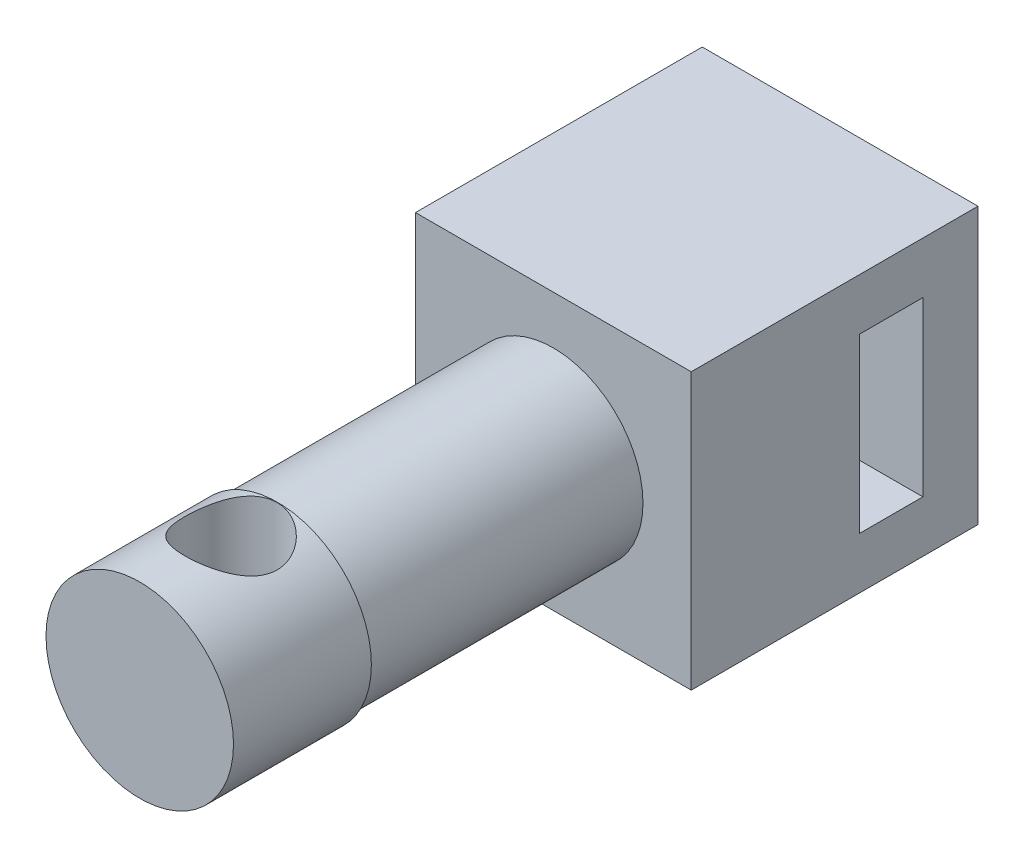
ISO-10303-21;
HEADER;
FILE_DESCRIPTION(('STEP AP214'),'2;1');
FILE_NAME('part.step','',(''),(''),'','','');
FILE_SCHEMA(('AUTOMOTIVE_DESIGN { 1 0 10303 214 1 1 1 1 }'));
ENDSEC;
DATA;
#1=APPLICATION_CONTEXT('core data for automotive mechanical design processes');
#2=APPLICATION_PROTOCOL_DEFINITION('international standard','automotive_design',2000,#1);
#3=PRODUCT_CONTEXT('',#1,'mechanical');
#4=PRODUCT('Part','Part','',(#3));
#5=PRODUCT_RELATED_PRODUCT_CATEGORY('part','',(#4));
#6=PRODUCT_DEFINITION_FORMATION('','',#4);
#7=PRODUCT_DEFINITION_CONTEXT('part definition',#1,'design');
#8=PRODUCT_DEFINITION('design','',#6,#7);
#9=PRODUCT_DEFINITION_SHAPE('','',#8);
#10=(LENGTH_UNIT() NAMED_UNIT(*) SI_UNIT(.MILLI.,.METRE.));
#11=(NAMED_UNIT(*) PLANE_ANGLE_UNIT() SI_UNIT($,.RADIAN.));
#12=(NAMED_UNIT(*) SI_UNIT($,.STERADIAN.) SOLID_ANGLE_UNIT());
#13=UNCERTAINTY_MEASURE_WITH_UNIT(LENGTH_MEASURE(1.E-05),#10,'distance_accuracy_value','');
#14=(GEOMETRIC_REPRESENTATION_CONTEXT(3) GLOBAL_UNCERTAINTY_ASSIGNED_CONTEXT((#13)) GLOBAL_UNIT_ASSIGNED_CONTEXT((#10,
#11,#12)) REPRESENTATION_CONTEXT('',''));
#15=CARTESIAN_POINT('',(0.,0.,0.));
#16=DIRECTION('',(0.,0.,1.));
#17=DIRECTION('',(1.,0.,0.));
#18=AXIS2_PLACEMENT_3D('',#15,#16,#17);
#19=CARTESIAN_POINT('',(0.,0.,16.1));
#20=DIRECTION('',(0.,0.,1.));
#21=DIRECTION('',(1.,0.,0.));
#22=AXIS2_PLACEMENT_3D('',#19,#20,#21);
#23=PLANE('',#22);
#24=CARTESIAN_POINT('',(0.,9.85,16.1));
#25=DIRECTION('',(0.,0.,1.));
#26=DIRECTION('',(1.,0.,0.));
#27=AXIS2_PLACEMENT_3D('',#24,#25,#26);
#28=CIRCLE('',#27,3.4);
#29=CARTESIAN_POINT('',(3.40000000000009,9.85,16.1));
#30=VERTEX_POINT('',#29);
#31=EDGE_CURVE('E385',#30,#30,#28,.T.);
#32=ORIENTED_EDGE('',*,*,#31,.T.);
#33=EDGE_LOOP('',(#32));
#34=FACE_BOUND('',#33,.T.);
#35=ADVANCED_FACE('F98',(#34),#23,.T.);
#36=CARTESIAN_POINT('',(0.,0.,11.1));
#37=DIRECTION('',(0.,0.,1.));
#38=DIRECTION('',(1.,0.,0.));
#39=AXIS2_PLACEMENT_3D('',#36,#37,#38);
#40=PLANE('',#39);
#41=CARTESIAN_POINT('',(0.,9.85,11.1));
#42=DIRECTION('',(0.,0.,1.));
#43=DIRECTION('',(1.,0.,0.));
#44=AXIS2_PLACEMENT_3D('',#41,#42,#43);
#45=CIRCLE('',#44,3.25);
#46=CARTESIAN_POINT('',(3.25,9.85,11.1));
#47=VERTEX_POINT('',#46);
#48=EDGE_CURVE('E207',#47,#47,#45,.T.);
#49=ORIENTED_EDGE('',*,*,#48,.T.);
#50=EDGE_LOOP('',(#49));
#51=FACE_BOUND('',#50,.T.);
#52=CARTESIAN_POINT('',(0.,9.85,11.1));
#53=DIRECTION('',(0.,0.,1.));
#54=DIRECTION('',(1.,0.,0.));
#55=AXIS2_PLACEMENT_3D('',#52,#53,#54);
#56=CIRCLE('',#55,3.4);
#57=CARTESIAN_POINT('',(3.40000000000009,9.85,11.1));
#58=VERTEX_POINT('',#57);
#59=EDGE_CURVE('E382',#58,#58,#56,.T.);
#60=ORIENTED_EDGE('',*,*,#59,.F.);
#61=EDGE_LOOP('',(#60));
#62=FACE_BOUND('',#61,.T.);
#63=ADVANCED_FACE('F297',(#51,#62),#40,.F.);
#64=CARTESIAN_POINT('',(0.,16.45,12.79));
#65=DIRECTION('',(0.,-1.,0.));
#66=DIRECTION('',(0.,0.,-1.));
#67=AXIS2_PLACEMENT_3D('',#64,#65,#66);
#68=CYLINDRICAL_SURFACE('',#67,1.675);
#69=CARTESIAN_POINT('',(0.,6.45,14.465));
#70=CARTESIAN_POINT('',(0.0882871792061729,6.45000400904776,14.4649954163885));
#71=CARTESIAN_POINT('',(0.176626211185832,6.45347315785561,14.457984175796));
#72=CARTESIAN_POINT('',(0.350649838604163,6.46700030885061,14.4302600717879));
#73=CARTESIAN_POINT('',(0.436331563152796,6.47706519384237,14.4095328952516));
#74=CARTESIAN_POINT('',(0.60233562305834,6.50272866845969,14.3553800635004));
#75=CARTESIAN_POINT('',(0.682675505426738,6.51830795655852,14.3219986720344));
#76=CARTESIAN_POINT('',(0.836519096595816,6.5535665344146,14.2437253210454));
#77=CARTESIAN_POINT('',(0.910022046068694,6.5732462787948,14.1988320850618));
#78=CARTESIAN_POINT('',(1.05297582120693,6.61625006576738,14.0957885327901));
#79=CARTESIAN_POINT('',(1.12192985124425,6.63972080906699,14.0370111627886));
#80=CARTESIAN_POINT('',(1.24945474589376,6.68716887444669,13.9092168699198));
#81=CARTESIAN_POINT('',(1.30801837698201,6.71114653653462,13.840192874544));
#82=CARTESIAN_POINT('',(1.41748664234534,6.75895449466706,13.6876694273657));
#83=CARTESIAN_POINT('',(1.46749178813093,6.78263985513284,13.6034736742731));
#84=CARTESIAN_POINT('',(1.55242059767323,6.8247310603081,13.4265708784595));
#85=CARTESIAN_POINT('',(1.58735472786879,6.84314056597278,13.3338697969049));
#86=CARTESIAN_POINT('',(1.63891646197032,6.87094463835127,13.1481886231686));
#87=CARTESIAN_POINT('',(1.65650370285459,6.88080756141553,13.0555486014029));
#88=CARTESIAN_POINT('',(1.67581844607841,6.89166099045505,12.8681505848692));
#89=CARTESIAN_POINT('',(1.67756077414817,6.89265979037079,12.7733946531677));
#90=CARTESIAN_POINT('',(1.66584143661571,6.88605090621676,12.5961879312901));
#91=CARTESIAN_POINT('',(1.65410884483375,6.87942182797977,12.5135775468775));
#92=CARTESIAN_POINT('',(1.61875936185074,6.86001328974783,12.3516961395594));
#93=CARTESIAN_POINT('',(1.59513888169567,6.84723197244245,12.2724261329511));
#94=CARTESIAN_POINT('',(1.53624368290819,6.81667297999784,12.1172179664189));
#95=CARTESIAN_POINT('',(1.50070987258089,6.79878567376079,12.0414007206949));
#96=CARTESIAN_POINT('',(1.4191939089499,6.76002861789904,11.8964476686919));
#97=CARTESIAN_POINT('',(1.3732073120358,6.73915760126591,11.8273147218595));
#98=CARTESIAN_POINT('',(1.26551699447029,6.69369167631314,11.6887724262714));
#99=CARTESIAN_POINT('',(1.20257791395622,6.6689538177496,11.6203670137203));
#100=CARTESIAN_POINT('',(1.06598892848053,6.62061682892649,11.4946574318073));
#101=CARTESIAN_POINT('',(0.992332145095995,6.59701844301153,11.437360447127));
#102=CARTESIAN_POINT('',(0.832277847307563,6.55234716671061,11.333135101527));
#103=CARTESIAN_POINT('',(0.745460083117523,6.53143275447305,11.2867794758876));
#104=CARTESIAN_POINT('',(0.564025220942731,6.49584303152225,11.2097568257422));
#105=CARTESIAN_POINT('',(0.469423442458666,6.48115580010245,11.1790598028354));
#106=CARTESIAN_POINT('',(0.311670213605497,6.46375853040415,11.1430655469007));
#107=CARTESIAN_POINT('',(0.249926476516642,6.45862502920277,11.1325665314483));
#108=CARTESIAN_POINT('',(0.12546383289755,6.45174448628554,11.1185324312833));
#109=CARTESIAN_POINT('',(0.0627450114372447,6.44999715080094,11.114996742463));
#110=CARTESIAN_POINT('',(-0.0882871792060007,6.45000400904776,11.1150045836115));
#111=CARTESIAN_POINT('',(-0.176626211185659,6.45347315785561,11.1220158242039));
#112=CARTESIAN_POINT('',(-0.350649838603993,6.46700030885061,11.1497399282121));
#113=CARTESIAN_POINT('',(-0.436331563152627,6.47706519384237,11.1704671047484));
#114=CARTESIAN_POINT('',(-0.602335623058175,6.50272866845969,11.2246199364996));
#115=CARTESIAN_POINT('',(-0.682675505426575,6.51830795655852,11.2580013279656));
#116=CARTESIAN_POINT('',(-0.836519096595659,6.55356653441461,11.3362746789545));
#117=CARTESIAN_POINT('',(-0.910022046068541,6.5732462787948,11.3811679149381));
#118=CARTESIAN_POINT('',(-1.05297582120679,6.61625006576739,11.4842114672098));
#119=CARTESIAN_POINT('',(-1.12192985124411,6.639720809067,11.5429888372113));
#120=CARTESIAN_POINT('',(-1.24945474589364,6.68716887444671,11.6707831300801));
#121=CARTESIAN_POINT('',(-1.30801837698189,6.71114653653464,11.7398071254558));
#122=CARTESIAN_POINT('',(-1.41748664234524,6.75895449466709,11.8923305726341));
#123=CARTESIAN_POINT('',(-1.46749178813083,6.78263985513287,11.9765263257267));
#124=CARTESIAN_POINT('',(-1.55242059767315,6.82473106030815,12.1534291215403));
#125=CARTESIAN_POINT('',(-1.58735472786872,6.84314056597283,12.246130203095));
#126=CARTESIAN_POINT('',(-1.63891646197028,6.87094463835134,12.4318113768312));
#127=CARTESIAN_POINT('',(-1.65650370285456,6.88080756141561,12.524451398597));
#128=CARTESIAN_POINT('',(-1.67581844607841,6.89166099045515,12.7118494151306));
#129=CARTESIAN_POINT('',(-1.67756077414817,6.89265979037089,12.8066053468321));
#130=CARTESIAN_POINT('',(-1.66584143661573,6.88605090621686,12.9838120687097));
#131=CARTESIAN_POINT('',(-1.65410884483377,6.87942182797988,13.0664224531223));
#132=CARTESIAN_POINT('',(-1.61875936185079,6.86001328974795,13.2283038604404));
#133=CARTESIAN_POINT('',(-1.59513888169572,6.84723197244257,13.3075738670488));
#134=CARTESIAN_POINT('',(-1.53624368290826,6.81667297999797,13.4627820335809));
#135=CARTESIAN_POINT('',(-1.50070987258097,6.79878567376092,13.538599279305));
#136=CARTESIAN_POINT('',(-1.41919390895001,6.76002861789916,13.683552331308));
#137=CARTESIAN_POINT('',(-1.37320731203591,6.73915760126604,13.7526852781403));
#138=CARTESIAN_POINT('',(-1.26551699447043,6.69369167631327,13.8912275737284));
#139=CARTESIAN_POINT('',(-1.20257791395637,6.66895381774972,13.9596329862795));
#140=CARTESIAN_POINT('',(-1.0659889284807,6.6206168289266,14.0853425681925));
#141=CARTESIAN_POINT('',(-0.992332145096175,6.59701844301164,14.1426395528729));
#142=CARTESIAN_POINT('',(-0.832277847307761,6.5523471667107,14.2468648984729));
#143=CARTESIAN_POINT('',(-0.745460083117726,6.53143275447314,14.2932205241123));
#144=CARTESIAN_POINT('',(-0.564025220942941,6.49584303152231,14.3702431742577));
#145=CARTESIAN_POINT('',(-0.469423442458878,6.48115580010251,14.4009401971645));
#146=CARTESIAN_POINT('',(-0.311670213605649,6.46375853040418,14.4369344530993));
#147=CARTESIAN_POINT('',(-0.24992647651673,6.45862502920279,14.4474334685517));
#148=CARTESIAN_POINT('',(-0.125463832897509,6.45174448628555,14.4614675687167));
#149=CARTESIAN_POINT('',(-0.0627450114371386,6.44999715080094,14.465003257537));
#150=CARTESIAN_POINT('',(0.,6.45,14.465));
#151=B_SPLINE_CURVE_WITH_KNOTS('',3,(#69,#70,#71,#72,#73,#74,#75,#76,#77,#78,#79,#80,#81,#82,
#83,#84,#85,#86,#87,#88,#89,#90,#91,#92,#93,#94,#95,#96,#97,#98,#99,#100,#101,#102,#103,#104,
#105,#106,#107,#108,#109,#110,#111,#112,#113,#114,#115,#116,#117,#118,#119,#120,#121,#122,#123,
#124,#125,#126,#127,#128,#129,#130,#131,#132,#133,#134,#135,#136,#137,#138,#139,#140,#141,#142,
#143,#144,#145,#146,#147,#148,#149,#150),.UNSPECIFIED.,.T.,.F.,(4,2,2,2,2,2,2,2,2,2,2,2,2,2,2,2,
2,2,2,2,2,2,2,2,2,2,2,2,2,2,2,2,2,2,2,2,2,2,2,2,4),(0.,0.264615472637016,0.529507518346893,
0.793481410623898,1.0574845856191,1.33710243173149,1.61691418310247,1.91763760995452,
2.21815185448431,2.500911227548,2.78340600174401,3.03334409042691,3.28335768073376,
3.53920538357832,3.79516205457897,4.08247908841657,4.36998133701063,4.67023781002504,
4.96991687744241,5.15799335269931,5.34605351054286,5.61066898317987,5.87556102888975,
6.13953492116675,6.40353809616195,6.68315594227433,6.96296769364531,7.26369112049737,
7.56420536502716,7.84696473809086,8.12945951228689,8.37939760096978,8.62941119127663,
8.88525889412117,9.14121556512181,9.4285325989594,9.71603484755345,10.0162913205679,
10.3159703879853,10.5040468632423,10.6921070210861),.UNSPECIFIED.);
#152=CARTESIAN_POINT('',(0.,6.45,14.465));
#153=VERTEX_POINT('',#152);
#154=EDGE_CURVE('E12',#153,#153,#151,.T.);
#155=ORIENTED_EDGE('',*,*,#154,.F.);
#156=EDGE_LOOP('',(#155));
#157=FACE_BOUND('',#156,.T.);
#158=CARTESIAN_POINT('',(0.,13.25,14.465));
#159=CARTESIAN_POINT('',(-0.0882871792060006,13.2499959909522,14.4649954163885));
#160=CARTESIAN_POINT('',(-0.176626211185659,13.2465268421444,14.4579841757961));
#161=CARTESIAN_POINT('',(-0.350649838603992,13.2329996911494,14.4302600717879));
#162=CARTESIAN_POINT('',(-0.436331563152626,13.2229348061576,14.4095328952516));
#163=CARTESIAN_POINT('',(-0.602335623058174,13.1972713315403,14.3553800635004));
#164=CARTESIAN_POINT('',(-0.682675505426574,13.1816920434415,14.3219986720344));
#165=CARTESIAN_POINT('',(-0.836519096595659,13.1464334655854,14.2437253210455));
#166=CARTESIAN_POINT('',(-0.91002204606854,13.1267537212052,14.1988320850619));
#167=CARTESIAN_POINT('',(-1.05297582120679,13.0837499342326,14.0957885327902));
#168=CARTESIAN_POINT('',(-1.12192985124411,13.060279190933,14.0370111627887));
#169=CARTESIAN_POINT('',(-1.24945474589364,13.0128311255533,13.9092168699199));
#170=CARTESIAN_POINT('',(-1.30801837698189,12.9888534634654,13.8401928745442));
#171=CARTESIAN_POINT('',(-1.41748664234524,12.9410455053329,13.6876694273659));
#172=CARTESIAN_POINT('',(-1.46749178813083,12.9173601448671,13.6034736742733));
#173=CARTESIAN_POINT('',(-1.55242059767315,12.8752689396918,13.4265708784597));
#174=CARTESIAN_POINT('',(-1.58735472786872,12.8568594340272,13.333869796905));
#175=CARTESIAN_POINT('',(-1.63891646197028,12.8290553616487,13.1481886231688));
#176=CARTESIAN_POINT('',(-1.65650370285456,12.8191924385844,13.055548601403));
#177=CARTESIAN_POINT('',(-1.67581844607841,12.8083390095448,12.8681505848694));
#178=CARTESIAN_POINT('',(-1.67756077414817,12.8073402096291,12.7733946531679));
#179=CARTESIAN_POINT('',(-1.66584143661573,12.8139490937831,12.5961879312903));
#180=CARTESIAN_POINT('',(-1.65410884483377,12.8205781720201,12.5135775468777));
#181=CARTESIAN_POINT('',(-1.61875936185079,12.839986710252,12.3516961395596));
#182=CARTESIAN_POINT('',(-1.59513888169572,12.8527680275574,12.2724261329512));
#183=CARTESIAN_POINT('',(-1.53624368290827,12.883327020002,12.1172179664191));
#184=CARTESIAN_POINT('',(-1.50070987258097,12.9012143262391,12.041400720695));
#185=CARTESIAN_POINT('',(-1.41919390895001,12.9399713821008,11.896447668692));
#186=CARTESIAN_POINT('',(-1.37320731203591,12.960842398734,11.8273147218597));
#187=CARTESIAN_POINT('',(-1.26551699447043,13.0063083236867,11.6887724262716));
#188=CARTESIAN_POINT('',(-1.20257791395637,13.0310461822503,11.6203670137205));
#189=CARTESIAN_POINT('',(-1.0659889284807,13.0793831710734,11.4946574318075));
#190=CARTESIAN_POINT('',(-0.992332145096178,13.1029815569884,11.4373604471271));
#191=CARTESIAN_POINT('',(-0.832277847307764,13.1476528332893,11.3331351015271));
#192=CARTESIAN_POINT('',(-0.745460083117729,13.1685672455269,11.2867794758877));
#193=CARTESIAN_POINT('',(-0.564025220942944,13.2041569684777,11.2097568257423));
#194=CARTESIAN_POINT('',(-0.46942344245888,13.2188441998975,11.1790598028355));
#195=CARTESIAN_POINT('',(-0.311670213605664,13.2362414695958,11.1430655469008));
#196=CARTESIAN_POINT('',(-0.24992647651676,13.2413749707972,11.1325665314483));
#197=CARTESIAN_POINT('',(-0.125463832897567,13.2482555137144,11.1185324312833));
#198=CARTESIAN_POINT('',(-0.0627450114372098,13.2500028491991,11.114996742463));
#199=CARTESIAN_POINT('',(0.0882871792061021,13.2499959909522,11.1150045836115));
#200=CARTESIAN_POINT('',(0.176626211185775,13.2465268421444,11.1220158242039));
#201=CARTESIAN_POINT('',(0.350649838604136,13.2329996911494,11.1497399282121));
#202=CARTESIAN_POINT('',(0.436331563152783,13.2229348061576,11.1704671047484));
#203=CARTESIAN_POINT('',(0.602335623058342,13.1972713315403,11.2246199364996));
#204=CARTESIAN_POINT('',(0.68267550542674,13.1816920434415,11.2580013279656));
#205=CARTESIAN_POINT('',(0.836519096595818,13.1464334655854,11.3362746789546));
#206=CARTESIAN_POINT('',(0.910022046068695,13.1267537212052,11.3811679149382));
#207=CARTESIAN_POINT('',(1.05297582120693,13.0837499342326,11.4842114672099));
#208=CARTESIAN_POINT('',(1.12192985124425,13.060279190933,11.5429888372114));
#209=CARTESIAN_POINT('',(1.24945474589377,13.0128311255533,11.6707831300802));
#210=CARTESIAN_POINT('',(1.30801837698201,12.9888534634654,11.739807125456));
#211=CARTESIAN_POINT('',(1.41748664234534,12.9410455053329,11.8923305726343));
#212=CARTESIAN_POINT('',(1.46749178813093,12.9173601448672,11.9765263257269));
#213=CARTESIAN_POINT('',(1.55242059767323,12.8752689396919,12.1534291215405));
#214=CARTESIAN_POINT('',(1.58735472786879,12.8568594340272,12.2461302030951));
#215=CARTESIAN_POINT('',(1.63891646197032,12.8290553616487,12.4318113768314));
#216=CARTESIAN_POINT('',(1.65650370285459,12.8191924385845,12.5244513985971));
#217=CARTESIAN_POINT('',(1.67581844607841,12.8083390095449,12.7118494151308));
#218=CARTESIAN_POINT('',(1.67756077414817,12.8073402096292,12.8066053468323));
#219=CARTESIAN_POINT('',(1.66584143661571,12.8139490937832,12.9838120687099));
#220=CARTESIAN_POINT('',(1.65410884483374,12.8205781720202,13.0664224531225));
#221=CARTESIAN_POINT('',(1.61875936185074,12.8399867102522,13.2283038604406));
#222=CARTESIAN_POINT('',(1.59513888169567,12.8527680275575,13.3075738670489));
#223=CARTESIAN_POINT('',(1.53624368290819,12.8833270200022,13.4627820335811));
#224=CARTESIAN_POINT('',(1.50070987258089,12.9012143262392,13.5385992793051));
#225=CARTESIAN_POINT('',(1.41919390894991,12.939971382101,13.6835523313081));
#226=CARTESIAN_POINT('',(1.3732073120358,12.9608423987341,13.7526852781404));
#227=CARTESIAN_POINT('',(1.26551699447029,13.0063083236869,13.8912275737286));
#228=CARTESIAN_POINT('',(1.20257791395622,13.0310461822504,13.9596329862797));
#229=CARTESIAN_POINT('',(1.06598892848053,13.0793831710735,14.0853425681927));
#230=CARTESIAN_POINT('',(0.992332145095993,13.1029815569885,14.142639552873));
#231=CARTESIAN_POINT('',(0.832277847307561,13.1476528332894,14.246864898473));
#232=CARTESIAN_POINT('',(0.745460083117521,13.1685672455269,14.2932205241124));
#233=CARTESIAN_POINT('',(0.564025220942729,13.2041569684777,14.3702431742578));
#234=CARTESIAN_POINT('',(0.469423442458664,13.2188441998975,14.4009401971646));
#235=CARTESIAN_POINT('',(0.311670213605495,13.2362414695958,14.4369344530993));
#236=CARTESIAN_POINT('',(0.24992647651664,13.2413749707972,14.4474334685517));
#237=CARTESIAN_POINT('',(0.125463832897549,13.2482555137145,14.4614675687167));
#238=CARTESIAN_POINT('',(0.0627450114372443,13.2500028491991,14.465003257537));
#239=CARTESIAN_POINT('',(0.,13.25,14.465));
#240=B_SPLINE_CURVE_WITH_KNOTS('',3,(#158,#159,#160,#161,#162,#163,#164,#165,#166,#167,#168,
#169,#170,#171,#172,#173,#174,#175,#176,#177,#178,#179,#180,#181,#182,#183,#184,#185,#186,#187,
#188,#189,#190,#191,#192,#193,#194,#195,#196,#197,#198,#199,#200,#201,#202,#203,#204,#205,#206,
#207,#208,#209,#210,#211,#212,#213,#214,#215,#216,#217,#218,#219,#220,#221,#222,#223,#224,#225,
#226,#227,#228,#229,#230,#231,#232,#233,#234,#235,#236,#237,#238,#239),.UNSPECIFIED.,.T.,.F.,(4,
2,2,2,2,2,2,2,2,2,2,2,2,2,2,2,2,2,2,2,2,2,2,2,2,2,2,2,2,2,2,2,2,2,2,2,2,2,2,2,4),(0.,
0.264615472637013,0.529507518346888,0.79348141062389,1.05748458561909,1.33710243173148,
1.61691418310245,1.91763760995451,2.2181518544843,2.50091122754801,2.78340600174403,
3.03334409042692,3.28335768073377,3.53920538357831,3.79516205457895,4.08247908841654,
4.36998133701059,4.67023781002501,4.9699168774424,5.15799335269944,5.34605351054315,
5.61066898318021,5.87556102889013,6.13953492116713,6.40353809616234,6.68315594227472,
6.9629676936457,7.26369112049775,7.56420536502754,7.84696473809124,8.12945951228724,
8.37939760097014,8.62941119127699,8.88525889412155,9.1412155651222,9.4285325989598,
9.71603484755386,10.0162913205683,10.3159703879856,10.5040468632425,10.6921070210861),.UNSPECIFIED.);
#241=CARTESIAN_POINT('',(0.,13.25,14.465));
#242=VERTEX_POINT('',#241);
#243=EDGE_CURVE('E111',#242,#242,#240,.T.);
#244=ORIENTED_EDGE('',*,*,#243,.F.);
#245=EDGE_LOOP('',(#244));
#246=FACE_BOUND('',#245,.T.);
#247=ADVANCED_FACE('F279',(#157,#246),#68,.F.);
#248=CARTESIAN_POINT('',(5.,5.,5.));
#249=DIRECTION('',(-1.,0.,0.));
#250=DIRECTION('',(0.,0.,1.));
#251=AXIS2_PLACEMENT_3D('',#248,#249,#250);
#252=PLANE('',#251);
#253=DIRECTION('',(0.,0.,1.));
#254=VECTOR('',#253,1.);
#255=CARTESIAN_POINT('',(5.,14.85,-7.3));
#256=LINE('',#255,#254);
#257=CARTESIAN_POINT('',(5.,14.85,-9.3));
#258=VERTEX_POINT('',#257);
#259=CARTESIAN_POINT('',(5.,14.85,1.1));
#260=VERTEX_POINT('',#259);
#261=EDGE_CURVE('E179',#258,#260,#256,.T.);
#262=ORIENTED_EDGE('',*,*,#261,.T.);
#263=DIRECTION('',(0.,1.,0.));
#264=VECTOR('',#263,1.);
#265=CARTESIAN_POINT('',(5.,4.85,1.1));
#266=LINE('',#265,#264);
#267=CARTESIAN_POINT('',(5.,4.85,1.1));
#268=VERTEX_POINT('',#267);
#269=EDGE_CURVE('E183',#268,#260,#266,.T.);
#270=ORIENTED_EDGE('',*,*,#269,.F.);
#271=DIRECTION('',(0.,0.,1.));
#272=VECTOR('',#271,1.);
#273=CARTESIAN_POINT('',(5.,4.85,-7.3));
#274=LINE('',#273,#272);
#275=CARTESIAN_POINT('',(5.,4.85,-9.3));
#276=VERTEX_POINT('',#275);
#277=EDGE_CURVE('E268',#276,#268,#274,.T.);
#278=ORIENTED_EDGE('',*,*,#277,.F.);
#279=DIRECTION('',(0.,-1.,0.));
#280=VECTOR('',#279,1.);
#281=CARTESIAN_POINT('',(5.,4.85,-9.3));
#282=LINE('',#281,#280);
#283=EDGE_CURVE('E185',#258,#276,#282,.T.);
#284=ORIENTED_EDGE('',*,*,#283,.F.);
#285=EDGE_LOOP('',(#262,#270,#278,#284));
#286=FACE_BOUND('',#285,.T.);
#287=DIRECTION('',(0.,1.,0.));
#288=VECTOR('',#287,1.);
#289=CARTESIAN_POINT('',(5.,4.85,-5.));
#290=LINE('',#289,#288);
#291=CARTESIAN_POINT('',(5.,6.72076154099223,-5.));
#292=VERTEX_POINT('',#291);
#293=CARTESIAN_POINT('',(5.,12.9792384590078,-5.));
#294=VERTEX_POINT('',#293);
#295=EDGE_CURVE('E204',#292,#294,#290,.T.);
#296=ORIENTED_EDGE('',*,*,#295,.T.);
#297=DIRECTION('',(0.,0.,1.));
#298=VECTOR('',#297,1.);
#299=CARTESIAN_POINT('',(5.,12.9792384590078,-7.3));
#300=LINE('',#299,#298);
#301=CARTESIAN_POINT('',(5.,12.9792384590078,-7.3));
#302=VERTEX_POINT('',#301);
#303=EDGE_CURVE('E190',#302,#294,#300,.T.);
#304=ORIENTED_EDGE('',*,*,#303,.F.);
#305=DIRECTION('',(0.,-1.,0.));
#306=VECTOR('',#305,1.);
#307=CARTESIAN_POINT('',(5.,4.85,-7.3));
#308=LINE('',#307,#306);
#309=CARTESIAN_POINT('',(5.,6.72076154099223,-7.3));
#310=VERTEX_POINT('',#309);
#311=EDGE_CURVE('E219',#302,#310,#308,.T.);
#312=ORIENTED_EDGE('',*,*,#311,.T.);
#313=DIRECTION('',(0.,0.,1.));
#314=VECTOR('',#313,1.);
#315=CARTESIAN_POINT('',(5.,6.72076154099223,-7.3));
#316=LINE('',#315,#314);
#317=EDGE_CURVE('E270',#310,#292,#316,.T.);
#318=ORIENTED_EDGE('',*,*,#317,.T.);
#319=EDGE_LOOP('',(#296,#304,#312,#318));
#320=FACE_BOUND('',#319,.T.);
#321=ADVANCED_FACE('F100',(#286,#320),#252,.F.);
#322=CARTESIAN_POINT('',(-5.,5.,5.));
#323=DIRECTION('',(1.,0.,0.));
#324=DIRECTION('',(0.,0.,-1.));
#325=AXIS2_PLACEMENT_3D('',#322,#323,#324);
#326=PLANE('',#325);
#327=DIRECTION('',(0.,0.,1.));
#328=VECTOR('',#327,1.);
#329=CARTESIAN_POINT('',(-5.,4.85,-7.3));
#330=LINE('',#329,#328);
#331=CARTESIAN_POINT('',(-5.,4.85,-9.3));
#332=VERTEX_POINT('',#331);
#333=CARTESIAN_POINT('',(-5.,4.85,1.1));
#334=VERTEX_POINT('',#333);
#335=EDGE_CURVE('E266',#332,#334,#330,.T.);
#336=ORIENTED_EDGE('',*,*,#335,.T.);
#337=DIRECTION('',(0.,-1.,0.));
#338=VECTOR('',#337,1.);
#339=CARTESIAN_POINT('',(-5.,4.85,1.1));
#340=LINE('',#339,#338);
#341=CARTESIAN_POINT('',(-5.,14.85,1.1));
#342=VERTEX_POINT('',#341);
#343=EDGE_CURVE('E198',#342,#334,#340,.T.);
#344=ORIENTED_EDGE('',*,*,#343,.F.);
#345=DIRECTION('',(0.,0.,1.));
#346=VECTOR('',#345,1.);
#347=CARTESIAN_POINT('',(-5.,14.85,-7.3));
#348=LINE('',#347,#346);
#349=CARTESIAN_POINT('',(-5.,14.85,-9.3));
#350=VERTEX_POINT('',#349);
#351=EDGE_CURVE('E189',#350,#342,#348,.T.);
#352=ORIENTED_EDGE('',*,*,#351,.F.);
#353=DIRECTION('',(0.,1.,0.));
#354=VECTOR('',#353,1.);
#355=CARTESIAN_POINT('',(-5.,4.85,-9.3));
#356=LINE('',#355,#354);
#357=EDGE_CURVE('E228',#332,#350,#356,.T.);
#358=ORIENTED_EDGE('',*,*,#357,.F.);
#359=EDGE_LOOP('',(#336,#344,#352,#358));
#360=FACE_BOUND('',#359,.T.);
#361=ADVANCED_FACE('F356',(#360),#326,.F.);
#362=CARTESIAN_POINT('',(2.91017511363836,5.04057115574417,-7.3));
#363=DIRECTION('',(0.5,0.866025403784439,0.));
#364=DIRECTION('',(-0.866025403784439,0.5,0.));
#365=AXIS2_PLACEMENT_3D('',#362,#363,#364);
#366=PLANE('',#365);
#367=DIRECTION('',(-0.866025403784439,0.5,0.));
#368=VECTOR('',#367,1.);
#369=CARTESIAN_POINT('',(2.91017511363836,5.04057115574417,-5.));
#370=LINE('',#369,#368);
#371=CARTESIAN_POINT('',(0.,6.72076154099223,-5.));
#372=VERTEX_POINT('',#371);
#373=CARTESIAN_POINT('',(-2.71,8.28538077049611,-5.));
#374=VERTEX_POINT('',#373);
#375=EDGE_CURVE('E231',#372,#374,#370,.T.);
#376=ORIENTED_EDGE('',*,*,#375,.F.);
#377=DIRECTION('',(0.,0.,1.));
#378=VECTOR('',#377,1.);
#379=CARTESIAN_POINT('',(0.,6.72076154099223,-7.3));
#380=LINE('',#379,#378);
#381=CARTESIAN_POINT('',(0.,6.72076154099223,-7.3));
#382=VERTEX_POINT('',#381);
#383=EDGE_CURVE('E273',#382,#372,#380,.T.);
#384=ORIENTED_EDGE('',*,*,#383,.F.);
#385=DIRECTION('',(-0.866025403784439,0.5,0.));
#386=VECTOR('',#385,1.);
#387=CARTESIAN_POINT('',(2.91017511363836,5.04057115574417,-7.3));
#388=LINE('',#387,#386);
#389=CARTESIAN_POINT('',(-2.71,8.28538077049611,-7.3));
#390=VERTEX_POINT('',#389);
#391=EDGE_CURVE('E124',#382,#390,#388,.T.);
#392=ORIENTED_EDGE('',*,*,#391,.T.);
#393=DIRECTION('',(0.,0.,1.));
#394=VECTOR('',#393,1.);
#395=CARTESIAN_POINT('',(-2.71,8.28538077049611,-7.3));
#396=LINE('',#395,#394);
#397=EDGE_CURVE('E245',#390,#374,#396,.T.);
#398=ORIENTED_EDGE('',*,*,#397,.T.);
#399=EDGE_LOOP('',(#376,#384,#392,#398));
#400=FACE_BOUND('',#399,.T.);
#401=ADVANCED_FACE('F353',(#400),#366,.T.);
#402=CARTESIAN_POINT('',(0.,6.72076154099223,-7.3));
#403=DIRECTION('',(0.,-1.,0.));
#404=DIRECTION('',(0.,0.,-1.));
#405=AXIS2_PLACEMENT_3D('',#402,#403,#404);
#406=PLANE('',#405);
#407=DIRECTION('',(1.,0.,0.));
#408=VECTOR('',#407,1.);
#409=CARTESIAN_POINT('',(0.,6.72076154099223,-5.));
#410=LINE('',#409,#408);
#411=EDGE_CURVE('E247',#372,#292,#410,.T.);
#412=ORIENTED_EDGE('',*,*,#411,.T.);
#413=ORIENTED_EDGE('',*,*,#317,.F.);
#414=DIRECTION('',(1.,0.,0.));
#415=VECTOR('',#414,1.);
#416=CARTESIAN_POINT('',(0.,6.72076154099223,-7.3));
#417=LINE('',#416,#415);
#418=EDGE_CURVE('E235',#382,#310,#417,.T.);
#419=ORIENTED_EDGE('',*,*,#418,.F.);
#420=ORIENTED_EDGE('',*,*,#383,.T.);
#421=EDGE_LOOP('',(#412,#413,#419,#420));
#422=FACE_BOUND('',#421,.T.);
#423=ADVANCED_FACE('F349',(#422),#406,.F.);
#424=CARTESIAN_POINT('',(0.,4.85,-7.3));
#425=DIRECTION('',(0.,1.,0.));
#426=DIRECTION('',(0.,0.,1.));
#427=AXIS2_PLACEMENT_3D('',#424,#425,#426);
#428=PLANE('',#427);
#429=ORIENTED_EDGE('',*,*,#277,.T.);
#430=DIRECTION('',(1.,0.,0.));
#431=VECTOR('',#430,1.);
#432=CARTESIAN_POINT('',(-5.,4.85,1.1));
#433=LINE('',#432,#431);
#434=EDGE_CURVE('E203',#334,#268,#433,.T.);
#435=ORIENTED_EDGE('',*,*,#434,.F.);
#436=ORIENTED_EDGE('',*,*,#335,.F.);
#437=DIRECTION('',(-1.,0.,0.));
#438=VECTOR('',#437,1.);
#439=CARTESIAN_POINT('',(5.,4.85,-9.3));
#440=LINE('',#439,#438);
#441=EDGE_CURVE('E225',#276,#332,#440,.T.);
#442=ORIENTED_EDGE('',*,*,#441,.F.);
#443=EDGE_LOOP('',(#429,#435,#436,#442));
#444=FACE_BOUND('',#443,.T.);
#445=ADVANCED_FACE('F346',(#444),#428,.F.);
#446=CARTESIAN_POINT('',(0.,14.85,-7.3));
#447=DIRECTION('',(0.,1.,0.));
#448=DIRECTION('',(0.,0.,1.));
#449=AXIS2_PLACEMENT_3D('',#446,#447,#448);
#450=PLANE('',#449);
#451=ORIENTED_EDGE('',*,*,#351,.T.);
#452=DIRECTION('',(-1.,0.,0.));
#453=VECTOR('',#452,1.);
#454=CARTESIAN_POINT('',(-5.,14.85,1.1));
#455=LINE('',#454,#453);
#456=EDGE_CURVE('E193',#260,#342,#455,.T.);
#457=ORIENTED_EDGE('',*,*,#456,.F.);
#458=ORIENTED_EDGE('',*,*,#261,.F.);
#459=DIRECTION('',(1.,0.,0.));
#460=VECTOR('',#459,1.);
#461=CARTESIAN_POINT('',(5.,14.85,-9.3));
#462=LINE('',#461,#460);
#463=EDGE_CURVE('E222',#350,#258,#462,.T.);
#464=ORIENTED_EDGE('',*,*,#463,.F.);
#465=EDGE_LOOP('',(#451,#457,#458,#464));
#466=FACE_BOUND('',#465,.T.);
#467=ADVANCED_FACE('F194',(#466),#450,.T.);
#468=CARTESIAN_POINT('',(0.,12.9792384590078,-7.3));
#469=DIRECTION('',(0.,-1.,0.));
#470=DIRECTION('',(0.,0.,-1.));
#471=AXIS2_PLACEMENT_3D('',#468,#469,#470);
#472=PLANE('',#471);
#473=DIRECTION('',(1.,0.,0.));
#474=VECTOR('',#473,1.);
#475=CARTESIAN_POINT('',(0.,12.9792384590078,-5.));
#476=LINE('',#475,#474);
#477=CARTESIAN_POINT('',(0.,12.9792384590078,-5.));
#478=VERTEX_POINT('',#477);
#479=EDGE_CURVE('E250',#478,#294,#476,.T.);
#480=ORIENTED_EDGE('',*,*,#479,.F.);
#481=DIRECTION('',(0.,0.,1.));
#482=VECTOR('',#481,1.);
#483=CARTESIAN_POINT('',(0.,12.9792384590078,-7.3));
#484=LINE('',#483,#482);
#485=CARTESIAN_POINT('',(0.,12.9792384590078,-7.3));
#486=VERTEX_POINT('',#485);
#487=EDGE_CURVE('E260',#486,#478,#484,.T.);
#488=ORIENTED_EDGE('',*,*,#487,.F.);
#489=DIRECTION('',(1.,0.,0.));
#490=VECTOR('',#489,1.);
#491=CARTESIAN_POINT('',(0.,12.9792384590078,-7.3));
#492=LINE('',#491,#490);
#493=EDGE_CURVE('E238',#486,#302,#492,.T.);
#494=ORIENTED_EDGE('',*,*,#493,.T.);
#495=ORIENTED_EDGE('',*,*,#303,.T.);
#496=EDGE_LOOP('',(#480,#488,#494,#495));
#497=FACE_BOUND('',#496,.T.);
#498=ADVANCED_FACE('F339',(#497),#472,.T.);
#499=CARTESIAN_POINT('',(-5.62017511363835,9.73442884425584,-7.3));
#500=DIRECTION('',(0.499999999999999,-0.866025403784439,0.));
#501=DIRECTION('',(0.866025403784439,0.499999999999999,0.));
#502=AXIS2_PLACEMENT_3D('',#499,#500,#501);
#503=PLANE('',#502);
#504=DIRECTION('',(0.866025403784439,0.499999999999999,0.));
#505=VECTOR('',#504,1.);
#506=CARTESIAN_POINT('',(-5.62017511363835,9.73442884425584,-5.));
#507=LINE('',#506,#505);
#508=CARTESIAN_POINT('',(-2.71,11.4146192295039,-5.));
#509=VERTEX_POINT('',#508);
#510=EDGE_CURVE('E252',#509,#478,#507,.T.);
#511=ORIENTED_EDGE('',*,*,#510,.F.);
#512=DIRECTION('',(0.,0.,1.));
#513=VECTOR('',#512,1.);
#514=CARTESIAN_POINT('',(-2.71,11.4146192295039,-7.3));
#515=LINE('',#514,#513);
#516=CARTESIAN_POINT('',(-2.71,11.4146192295039,-7.3));
#517=VERTEX_POINT('',#516);
#518=EDGE_CURVE('E257',#517,#509,#515,.T.);
#519=ORIENTED_EDGE('',*,*,#518,.F.);
#520=DIRECTION('',(0.866025403784439,0.499999999999999,0.));
#521=VECTOR('',#520,1.);
#522=CARTESIAN_POINT('',(-5.62017511363835,9.73442884425584,-7.3));
#523=LINE('',#522,#521);
#524=EDGE_CURVE('E118',#517,#486,#523,.T.);
#525=ORIENTED_EDGE('',*,*,#524,.T.);
#526=ORIENTED_EDGE('',*,*,#487,.T.);
#527=EDGE_LOOP('',(#511,#519,#525,#526));
#528=FACE_BOUND('',#527,.T.);
#529=ADVANCED_FACE('F335',(#528),#503,.T.);
#530=CARTESIAN_POINT('',(-2.71,0.,-7.3));
#531=DIRECTION('',(1.,0.,0.));
#532=DIRECTION('',(0.,1.,0.));
#533=AXIS2_PLACEMENT_3D('',#530,#531,#532);
#534=PLANE('',#533);
#535=DIRECTION('',(0.,1.,0.));
#536=VECTOR('',#535,1.);
#537=CARTESIAN_POINT('',(-2.71,0.,-5.));
#538=LINE('',#537,#536);
#539=EDGE_CURVE('E236',#374,#509,#538,.T.);
#540=ORIENTED_EDGE('',*,*,#539,.F.);
#541=ORIENTED_EDGE('',*,*,#397,.F.);
#542=DIRECTION('',(0.,1.,0.));
#543=VECTOR('',#542,1.);
#544=CARTESIAN_POINT('',(-2.71,0.,-7.3));
#545=LINE('',#544,#543);
#546=EDGE_CURVE('E242',#390,#517,#545,.T.);
#547=ORIENTED_EDGE('',*,*,#546,.T.);
#548=ORIENTED_EDGE('',*,*,#518,.T.);
#549=EDGE_LOOP('',(#540,#541,#547,#548));
#550=FACE_BOUND('',#549,.T.);
#551=ADVANCED_FACE('F331',(#550),#534,.T.);
#552=CARTESIAN_POINT('',(0.,0.,-7.3));
#553=DIRECTION('',(0.,0.,-1.));
#554=DIRECTION('',(-1.,0.,0.));
#555=AXIS2_PLACEMENT_3D('',#552,#553,#554);
#556=PLANE('',#555);
#557=CARTESIAN_POINT('',(0.,9.85,-7.3));
#558=DIRECTION('',(0.,0.,-1.));
#559=DIRECTION('',(-1.,0.,0.));
#560=AXIS2_PLACEMENT_3D('',#557,#558,#559);
#561=CIRCLE('',#560,1.675);
#562=CARTESIAN_POINT('',(-1.675,9.85,-7.3));
#563=VERTEX_POINT('',#562);
#564=EDGE_CURVE('E214',#563,#563,#561,.T.);
#565=ORIENTED_EDGE('',*,*,#564,.T.);
#566=EDGE_LOOP('',(#565));
#567=FACE_BOUND('',#566,.T.);
#568=ORIENTED_EDGE('',*,*,#391,.F.);
#569=ORIENTED_EDGE('',*,*,#418,.T.);
#570=ORIENTED_EDGE('',*,*,#311,.F.);
#571=ORIENTED_EDGE('',*,*,#493,.F.);
#572=ORIENTED_EDGE('',*,*,#524,.F.);
#573=ORIENTED_EDGE('',*,*,#546,.F.);
#574=EDGE_LOOP('',(#568,#569,#570,#571,#572,#573));
#575=FACE_BOUND('',#574,.T.);
#576=ADVANCED_FACE('F327',(#567,#575),#556,.F.);
#577=CARTESIAN_POINT('',(0.,0.,-9.3));
#578=DIRECTION('',(0.,0.,-1.));
#579=DIRECTION('',(-1.,0.,0.));
#580=AXIS2_PLACEMENT_3D('',#577,#578,#579);
#581=PLANE('',#580);
#582=ORIENTED_EDGE('',*,*,#463,.T.);
#583=ORIENTED_EDGE('',*,*,#283,.T.);
#584=ORIENTED_EDGE('',*,*,#441,.T.);
#585=ORIENTED_EDGE('',*,*,#357,.T.);
#586=EDGE_LOOP('',(#582,#583,#584,#585));
#587=FACE_BOUND('',#586,.T.);
#588=CARTESIAN_POINT('',(0.,9.85,-9.3));
#589=DIRECTION('',(0.,0.,-1.));
#590=DIRECTION('',(-1.,0.,0.));
#591=AXIS2_PLACEMENT_3D('',#588,#589,#590);
#592=CIRCLE('',#591,1.675);
#593=CARTESIAN_POINT('',(-1.675,9.85,-9.3));
#594=VERTEX_POINT('',#593);
#595=EDGE_CURVE('E216',#594,#594,#592,.T.);
#596=ORIENTED_EDGE('',*,*,#595,.F.);
#597=EDGE_LOOP('',(#596));
#598=FACE_BOUND('',#597,.T.);
#599=ADVANCED_FACE('F323',(#587,#598),#581,.T.);
#600=CARTESIAN_POINT('',(0.,9.85,-9.3));
#601=DIRECTION('',(0.,0.,1.));
#602=DIRECTION('',(1.,0.,0.));
#603=AXIS2_PLACEMENT_3D('',#600,#601,#602);
#604=CYLINDRICAL_SURFACE('',#603,1.675);
#605=ORIENTED_EDGE('',*,*,#595,.T.);
#606=EDGE_LOOP('',(#605));
#607=FACE_BOUND('',#606,.T.);
#608=ORIENTED_EDGE('',*,*,#564,.F.);
#609=EDGE_LOOP('',(#608));
#610=FACE_BOUND('',#609,.T.);
#611=ADVANCED_FACE('F317',(#607,#610),#604,.F.);
#612=CARTESIAN_POINT('',(0.,0.,1.1));
#613=DIRECTION('',(0.,0.,-1.));
#614=DIRECTION('',(-1.,0.,0.));
#615=AXIS2_PLACEMENT_3D('',#612,#613,#614);
#616=PLANE('',#615);
#617=CARTESIAN_POINT('',(0.,9.85,1.1));
#618=DIRECTION('',(0.,0.,1.));
#619=DIRECTION('',(1.,0.,0.));
#620=AXIS2_PLACEMENT_3D('',#617,#618,#619);
#621=CIRCLE('',#620,3.25);
#622=CARTESIAN_POINT('',(3.25,9.85,1.1));
#623=VERTEX_POINT('',#622);
#624=EDGE_CURVE('E210',#623,#623,#621,.T.);
#625=ORIENTED_EDGE('',*,*,#624,.F.);
#626=EDGE_LOOP('',(#625));
#627=FACE_BOUND('',#626,.T.);
#628=ORIENTED_EDGE('',*,*,#269,.T.);
#629=ORIENTED_EDGE('',*,*,#456,.T.);
#630=ORIENTED_EDGE('',*,*,#343,.T.);
#631=ORIENTED_EDGE('',*,*,#434,.T.);
#632=EDGE_LOOP('',(#628,#629,#630,#631));
#633=FACE_BOUND('',#632,.T.);
#634=ADVANCED_FACE('F201',(#627,#633),#616,.F.);
#635=CARTESIAN_POINT('',(0.,0.,-5.));
#636=DIRECTION('',(0.,0.,-1.));
#637=DIRECTION('',(-1.,0.,0.));
#638=AXIS2_PLACEMENT_3D('',#635,#636,#637);
#639=PLANE('',#638);
#640=CARTESIAN_POINT('',(0.,9.85,-5.));
#641=DIRECTION('',(0.,0.,-1.));
#642=DIRECTION('',(-1.,0.,0.));
#643=AXIS2_PLACEMENT_3D('',#640,#641,#642);
#644=CIRCLE('',#643,1.625);
#645=CARTESIAN_POINT('',(-1.625,9.85,-5.));
#646=VERTEX_POINT('',#645);
#647=EDGE_CURVE('E384',#646,#646,#644,.T.);
#648=ORIENTED_EDGE('',*,*,#647,.F.);
#649=EDGE_LOOP('',(#648));
#650=FACE_BOUND('',#649,.T.);
#651=ORIENTED_EDGE('',*,*,#510,.T.);
#652=ORIENTED_EDGE('',*,*,#479,.T.);
#653=ORIENTED_EDGE('',*,*,#295,.F.);
#654=ORIENTED_EDGE('',*,*,#411,.F.);
#655=ORIENTED_EDGE('',*,*,#375,.T.);
#656=ORIENTED_EDGE('',*,*,#539,.T.);
#657=EDGE_LOOP('',(#651,#652,#653,#654,#655,#656));
#658=FACE_BOUND('',#657,.T.);
#659=ADVANCED_FACE('F313',(#650,#658),#639,.T.);
#660=CARTESIAN_POINT('',(0.,9.85,11.1));
#661=DIRECTION('',(0.,0.,-1.));
#662=DIRECTION('',(-1.,0.,0.));
#663=AXIS2_PLACEMENT_3D('',#660,#661,#662);
#664=CYLINDRICAL_SURFACE('',#663,3.25);
#665=ORIENTED_EDGE('',*,*,#48,.F.);
#666=EDGE_LOOP('',(#665));
#667=FACE_BOUND('',#666,.T.);
#668=ORIENTED_EDGE('',*,*,#624,.T.);
#669=EDGE_LOOP('',(#668));
#670=FACE_BOUND('',#669,.T.);
#671=ADVANCED_FACE('F309',(#667,#670),#664,.T.);
#672=CARTESIAN_POINT('',(0.,9.85,-2.3));
#673=DIRECTION('',(0.,0.,-1.));
#674=DIRECTION('',(-1.,0.,0.));
#675=AXIS2_PLACEMENT_3D('',#672,#673,#674);
#676=CYLINDRICAL_SURFACE('',#675,1.625);
#677=CARTESIAN_POINT('',(0.,9.85,-2.3));
#678=DIRECTION('',(0.,0.,-1.));
#679=DIRECTION('',(-1.,0.,0.));
#680=AXIS2_PLACEMENT_3D('',#677,#678,#679);
#681=CIRCLE('',#680,1.625);
#682=CARTESIAN_POINT('',(-1.625,9.85,-2.3));
#683=VERTEX_POINT('',#682);
#684=EDGE_CURVE('E388',#683,#683,#681,.T.);
#685=CARTESIAN_POINT('',(-1.625,9.85,-2.3));
#686=CARTESIAN_POINT('',(-1.625,9.85,-2.328125));
#687=CARTESIAN_POINT('',(-1.625,9.85,-2.35625));
#688=CARTESIAN_POINT('',(-1.625,9.85,-2.4125));
#689=CARTESIAN_POINT('',(-1.625,9.85,-2.440625));
#690=CARTESIAN_POINT('',(-1.625,9.85,-2.496875));
#691=CARTESIAN_POINT('',(-1.625,9.85,-2.525));
#692=CARTESIAN_POINT('',(-1.625,9.85,-2.58125));
#693=CARTESIAN_POINT('',(-1.625,9.85,-2.609375));
#694=CARTESIAN_POINT('',(-1.625,9.85,-2.665625));
#695=CARTESIAN_POINT('',(-1.625,9.85,-2.69375));
#696=CARTESIAN_POINT('',(-1.625,9.85,-2.75));
#697=CARTESIAN_POINT('',(-1.625,9.85,-2.778125));
#698=CARTESIAN_POINT('',(-1.625,9.85,-2.834375));
#699=CARTESIAN_POINT('',(-1.625,9.85,-2.8625));
#700=CARTESIAN_POINT('',(-1.625,9.85,-2.91875));
#701=CARTESIAN_POINT('',(-1.625,9.85,-2.946875));
#702=CARTESIAN_POINT('',(-1.625,9.85,-3.003125));
#703=CARTESIAN_POINT('',(-1.625,9.85,-3.03125));
#704=CARTESIAN_POINT('',(-1.625,9.85,-3.0875));
#705=CARTESIAN_POINT('',(-1.625,9.85,-3.115625));
#706=CARTESIAN_POINT('',(-1.625,9.85,-3.171875));
#707=CARTESIAN_POINT('',(-1.625,9.85,-3.2));
#708=CARTESIAN_POINT('',(-1.625,9.85,-3.25625));
#709=CARTESIAN_POINT('',(-1.625,9.85,-3.284375));
#710=CARTESIAN_POINT('',(-1.625,9.85,-3.340625));
#711=CARTESIAN_POINT('',(-1.625,9.85,-3.36875));
#712=CARTESIAN_POINT('',(-1.625,9.85,-3.425));
#713=CARTESIAN_POINT('',(-1.625,9.85,-3.453125));
#714=CARTESIAN_POINT('',(-1.625,9.85,-3.509375));
#715=CARTESIAN_POINT('',(-1.625,9.85,-3.5375));
#716=CARTESIAN_POINT('',(-1.625,9.85,-3.59375));
#717=CARTESIAN_POINT('',(-1.625,9.85,-3.621875));
#718=CARTESIAN_POINT('',(-1.625,9.85,-3.678125));
#719=CARTESIAN_POINT('',(-1.625,9.85,-3.70625));
#720=CARTESIAN_POINT('',(-1.625,9.85,-3.7625));
#721=CARTESIAN_POINT('',(-1.625,9.85,-3.790625));
#722=CARTESIAN_POINT('',(-1.625,9.85,-3.846875));
#723=CARTESIAN_POINT('',(-1.625,9.85,-3.875));
#724=CARTESIAN_POINT('',(-1.625,9.85,-3.93125));
#725=CARTESIAN_POINT('',(-1.625,9.85,-3.959375));
#726=CARTESIAN_POINT('',(-1.625,9.85,-4.015625));
#727=CARTESIAN_POINT('',(-1.625,9.85,-4.04375));
#728=CARTESIAN_POINT('',(-1.625,9.85,-4.1));
#729=CARTESIAN_POINT('',(-1.625,9.85,-4.128125));
#730=CARTESIAN_POINT('',(-1.625,9.85,-4.184375));
#731=CARTESIAN_POINT('',(-1.625,9.85,-4.2125));
#732=CARTESIAN_POINT('',(-1.625,9.85,-4.26875));
#733=CARTESIAN_POINT('',(-1.625,9.85,-4.296875));
#734=CARTESIAN_POINT('',(-1.625,9.85,-4.353125));
#735=CARTESIAN_POINT('',(-1.625,9.85,-4.38125));
#736=CARTESIAN_POINT('',(-1.625,9.85,-4.4375));
#737=CARTESIAN_POINT('',(-1.625,9.85,-4.465625));
#738=CARTESIAN_POINT('',(-1.625,9.85,-4.521875));
#739=CARTESIAN_POINT('',(-1.625,9.85,-4.55));
#740=CARTESIAN_POINT('',(-1.625,9.85,-4.60625));
#741=CARTESIAN_POINT('',(-1.625,9.85,-4.634375));
#742=CARTESIAN_POINT('',(-1.625,9.85,-4.690625));
#743=CARTESIAN_POINT('',(-1.625,9.85,-4.71875));
#744=CARTESIAN_POINT('',(-1.625,9.85,-4.775));
#745=CARTESIAN_POINT('',(-1.625,9.85,-4.803125));
#746=CARTESIAN_POINT('',(-1.625,9.85,-4.859375));
#747=CARTESIAN_POINT('',(-1.625,9.85,-4.8875));
#748=CARTESIAN_POINT('',(-1.625,9.85,-4.94375));
#749=CARTESIAN_POINT('',(-1.625,9.85,-4.971875));
#750=CARTESIAN_POINT('',(-1.625,9.85,-5.));
#751=B_SPLINE_CURVE_WITH_KNOTS('',3,(#685,#686,#687,#688,#689,#690,#691,#692,#693,#694,#695,
#696,#697,#698,#699,#700,#701,#702,#703,#704,#705,#706,#707,#708,#709,#710,#711,#712,#713,#714,
#715,#716,#717,#718,#719,#720,#721,#722,#723,#724,#725,#726,#727,#728,#729,#730,#731,#732,#733,
#734,#735,#736,#737,#738,#739,#740,#741,#742,#743,#744,#745,#746,#747,#748,#749,#750),
.UNSPECIFIED.,.F.,.F.,(4,2,2,2,2,2,2,2,2,2,2,2,2,2,2,2,2,2,2,2,2,2,2,2,2,2,2,2,2,2,2,2,4),(0.,
0.0843749999999998,0.16875,0.253125,0.3375,0.421875,0.50625,0.590625,0.675,0.759375,0.84375,
0.928125,1.0125,1.096875,1.18125,1.265625,1.35,1.434375,1.51875,1.603125,1.6875,1.771875,
1.85625,1.940625,2.025,2.109375,2.19375,2.278125,2.3625,2.446875,2.53125,2.615625,2.7),.UNSPECIFIED.);
#752=EDGE_CURVE('BSEAM291',#683,#646,#751,.T.);
#753=ORIENTED_EDGE('',*,*,#684,.F.);
#754=ORIENTED_EDGE('',*,*,#647,.T.);
#755=ORIENTED_EDGE('',*,*,#752,.T.);
#756=ORIENTED_EDGE('',*,*,#752,.F.);
#757=EDGE_LOOP('',(#753,#755,#754,#756));
#758=FACE_BOUND('',#757,.T.);
#759=ADVANCED_FACE('F291',(#758),#676,.F.);
#760=CARTESIAN_POINT('',(0.,9.85,-2.3));
#761=DIRECTION('',(0.,0.,-1.));
#762=DIRECTION('',(-1.,0.,0.));
#763=AXIS2_PLACEMENT_3D('',#760,#761,#762);
#764=PLANE('',#763);
#765=ORIENTED_EDGE('',*,*,#684,.T.);
#766=EDGE_LOOP('',(#765));
#767=FACE_BOUND('',#766,.T.);
#768=ADVANCED_FACE('F285',(#767),#764,.T.);
#769=CARTESIAN_POINT('',(0.,9.85,6.1));
#770=DIRECTION('',(0.,0.,1.));
#771=DIRECTION('',(1.,0.,0.));
#772=AXIS2_PLACEMENT_3D('',#769,#770,#771);
#773=CYLINDRICAL_SURFACE('',#772,3.4);
#774=ORIENTED_EDGE('',*,*,#31,.F.);
#775=EDGE_LOOP('',(#774));
#776=FACE_BOUND('',#775,.T.);
#777=ORIENTED_EDGE('',*,*,#243,.T.);
#778=EDGE_LOOP('',(#777));
#779=FACE_BOUND('',#778,.T.);
#780=ORIENTED_EDGE('',*,*,#59,.T.);
#781=EDGE_LOOP('',(#780));
#782=FACE_BOUND('',#781,.T.);
#783=ORIENTED_EDGE('',*,*,#154,.T.);
#784=EDGE_LOOP('',(#783));
#785=FACE_BOUND('',#784,.T.);
#786=ADVANCED_FACE('F282',(#776,#779,#782,#785),#773,.T.);
#787=CLOSED_SHELL('',(#35,#63,#247,#321,#361,#401,#423,#445,#467,#498,#529,#551,#576,#599,#611,
#634,#659,#671,#759,#768,#786));
#788=MANIFOLD_SOLID_BREP('B2',#787);
#789=ADVANCED_BREP_SHAPE_REPRESENTATION('',(#18,#788),#14);
#790=SHAPE_DEFINITION_REPRESENTATION(#9,#789);
ENDSEC;
END-ISO-10303-21;
